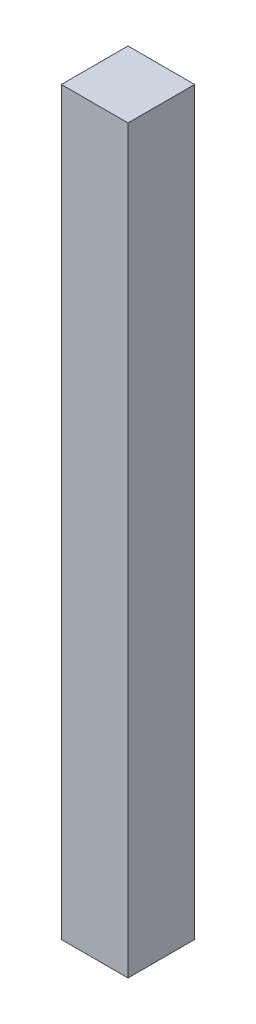
ISO-10303-21;
HEADER;
FILE_DESCRIPTION(('STEP AP214'),'2;1');
FILE_NAME('part.step','',(''),(''),'','','');
FILE_SCHEMA(('AUTOMOTIVE_DESIGN { 1 0 10303 214 1 1 1 1 }'));
ENDSEC;
DATA;
#1=APPLICATION_CONTEXT('core data for automotive mechanical design processes');
#2=APPLICATION_PROTOCOL_DEFINITION('international standard','automotive_design',2000,#1);
#3=PRODUCT_CONTEXT('',#1,'mechanical');
#4=PRODUCT('Part','Part','',(#3));
#5=PRODUCT_RELATED_PRODUCT_CATEGORY('part','',(#4));
#6=PRODUCT_DEFINITION_FORMATION('','',#4);
#7=PRODUCT_DEFINITION_CONTEXT('part definition',#1,'design');
#8=PRODUCT_DEFINITION('design','',#6,#7);
#9=PRODUCT_DEFINITION_SHAPE('','',#8);
#10=(LENGTH_UNIT() NAMED_UNIT(*) SI_UNIT(.MILLI.,.METRE.));
#11=(NAMED_UNIT(*) PLANE_ANGLE_UNIT() SI_UNIT($,.RADIAN.));
#12=(NAMED_UNIT(*) SI_UNIT($,.STERADIAN.) SOLID_ANGLE_UNIT());
#13=UNCERTAINTY_MEASURE_WITH_UNIT(LENGTH_MEASURE(1.E-05),#10,'distance_accuracy_value','');
#14=(GEOMETRIC_REPRESENTATION_CONTEXT(3) GLOBAL_UNCERTAINTY_ASSIGNED_CONTEXT((#13)) GLOBAL_UNIT_ASSIGNED_CONTEXT((#10,
#11,#12)) REPRESENTATION_CONTEXT('',''));
#15=CARTESIAN_POINT('',(0.,0.,0.));
#16=DIRECTION('',(0.,0.,1.));
#17=DIRECTION('',(1.,0.,0.));
#18=AXIS2_PLACEMENT_3D('',#15,#16,#17);
#19=CARTESIAN_POINT('',(637.,230.,26.));
#20=DIRECTION('',(1.,0.,0.));
#21=DIRECTION('',(0.,0.,-1.));
#22=AXIS2_PLACEMENT_3D('',#19,#20,#21);
#23=PLANE('',#22);
#24=DIRECTION('',(0.,-1.,0.));
#25=VECTOR('',#24,1.);
#26=CARTESIAN_POINT('',(637.,230.,8.));
#27=LINE('',#26,#25);
#28=CARTESIAN_POINT('',(637.,430.,8.));
#29=VERTEX_POINT('',#28);
#30=CARTESIAN_POINT('',(637.,230.,8.));
#31=VERTEX_POINT('',#30);
#32=EDGE_CURVE('E102',#29,#31,#27,.T.);
#33=ORIENTED_EDGE('',*,*,#32,.T.);
#34=DIRECTION('',(0.,0.,-1.));
#35=VECTOR('',#34,1.);
#36=CARTESIAN_POINT('',(637.,230.,26.));
#37=LINE('',#36,#35);
#38=CARTESIAN_POINT('',(637.,230.,26.));
#39=VERTEX_POINT('',#38);
#40=EDGE_CURVE('E11',#39,#31,#37,.T.);
#41=ORIENTED_EDGE('',*,*,#40,.F.);
#42=DIRECTION('',(0.,-1.,0.));
#43=VECTOR('',#42,1.);
#44=CARTESIAN_POINT('',(637.,230.,26.));
#45=LINE('',#44,#43);
#46=CARTESIAN_POINT('',(637.,430.,26.));
#47=VERTEX_POINT('',#46);
#48=EDGE_CURVE('E90',#47,#39,#45,.T.);
#49=ORIENTED_EDGE('',*,*,#48,.F.);
#50=DIRECTION('',(0.,0.,-1.));
#51=VECTOR('',#50,1.);
#52=CARTESIAN_POINT('',(637.,430.,26.));
#53=LINE('',#52,#51);
#54=EDGE_CURVE('E98',#47,#29,#53,.T.);
#55=ORIENTED_EDGE('',*,*,#54,.T.);
#56=EDGE_LOOP('',(#33,#41,#49,#55));
#57=FACE_BOUND('',#56,.T.);
#58=ADVANCED_FACE('F39',(#57),#23,.F.);
#59=CARTESIAN_POINT('',(637.,230.,26.));
#60=DIRECTION('',(0.,1.,0.));
#61=DIRECTION('',(0.,0.,1.));
#62=AXIS2_PLACEMENT_3D('',#59,#60,#61);
#63=PLANE('',#62);
#64=DIRECTION('',(1.,0.,0.));
#65=VECTOR('',#64,1.);
#66=CARTESIAN_POINT('',(637.,230.,8.));
#67=LINE('',#66,#65);
#68=CARTESIAN_POINT('',(655.,230.,8.));
#69=VERTEX_POINT('',#68);
#70=EDGE_CURVE('E94',#31,#69,#67,.T.);
#71=ORIENTED_EDGE('',*,*,#70,.T.);
#72=DIRECTION('',(0.,0.,-1.));
#73=VECTOR('',#72,1.);
#74=CARTESIAN_POINT('',(655.,230.,26.));
#75=LINE('',#74,#73);
#76=CARTESIAN_POINT('',(655.,230.,26.));
#77=VERTEX_POINT('',#76);
#78=EDGE_CURVE('E47',#77,#69,#75,.T.);
#79=ORIENTED_EDGE('',*,*,#78,.F.);
#80=DIRECTION('',(1.,0.,0.));
#81=VECTOR('',#80,1.);
#82=CARTESIAN_POINT('',(637.,230.,26.));
#83=LINE('',#82,#81);
#84=EDGE_CURVE('E85',#39,#77,#83,.T.);
#85=ORIENTED_EDGE('',*,*,#84,.F.);
#86=ORIENTED_EDGE('',*,*,#40,.T.);
#87=EDGE_LOOP('',(#71,#79,#85,#86));
#88=FACE_BOUND('',#87,.T.);
#89=ADVANCED_FACE('F93',(#88),#63,.F.);
#90=CARTESIAN_POINT('',(655.,230.,26.));
#91=DIRECTION('',(-1.,0.,0.));
#92=DIRECTION('',(0.,0.,1.));
#93=AXIS2_PLACEMENT_3D('',#90,#91,#92);
#94=PLANE('',#93);
#95=DIRECTION('',(0.,1.,0.));
#96=VECTOR('',#95,1.);
#97=CARTESIAN_POINT('',(655.,230.,8.));
#98=LINE('',#97,#96);
#99=CARTESIAN_POINT('',(655.,430.,8.));
#100=VERTEX_POINT('',#99);
#101=EDGE_CURVE('E72',#69,#100,#98,.T.);
#102=ORIENTED_EDGE('',*,*,#101,.T.);
#103=DIRECTION('',(0.,0.,-1.));
#104=VECTOR('',#103,1.);
#105=CARTESIAN_POINT('',(655.,430.,26.));
#106=LINE('',#105,#104);
#107=CARTESIAN_POINT('',(655.,430.,26.));
#108=VERTEX_POINT('',#107);
#109=EDGE_CURVE('E95',#108,#100,#106,.T.);
#110=ORIENTED_EDGE('',*,*,#109,.F.);
#111=DIRECTION('',(0.,1.,0.));
#112=VECTOR('',#111,1.);
#113=CARTESIAN_POINT('',(655.,230.,26.));
#114=LINE('',#113,#112);
#115=EDGE_CURVE('E88',#77,#108,#114,.T.);
#116=ORIENTED_EDGE('',*,*,#115,.F.);
#117=ORIENTED_EDGE('',*,*,#78,.T.);
#118=EDGE_LOOP('',(#102,#110,#116,#117));
#119=FACE_BOUND('',#118,.T.);
#120=ADVANCED_FACE('F96',(#119),#94,.F.);
#121=CARTESIAN_POINT('',(637.,430.,26.));
#122=DIRECTION('',(0.,-1.,0.));
#123=DIRECTION('',(0.,0.,-1.));
#124=AXIS2_PLACEMENT_3D('',#121,#122,#123);
#125=PLANE('',#124);
#126=DIRECTION('',(-1.,0.,0.));
#127=VECTOR('',#126,1.);
#128=CARTESIAN_POINT('',(637.,430.,8.));
#129=LINE('',#128,#127);
#130=EDGE_CURVE('E78',#100,#29,#129,.T.);
#131=ORIENTED_EDGE('',*,*,#130,.T.);
#132=ORIENTED_EDGE('',*,*,#54,.F.);
#133=DIRECTION('',(-1.,0.,0.));
#134=VECTOR('',#133,1.);
#135=CARTESIAN_POINT('',(637.,430.,26.));
#136=LINE('',#135,#134);
#137=EDGE_CURVE('E55',#108,#47,#136,.T.);
#138=ORIENTED_EDGE('',*,*,#137,.F.);
#139=ORIENTED_EDGE('',*,*,#109,.T.);
#140=EDGE_LOOP('',(#131,#132,#138,#139));
#141=FACE_BOUND('',#140,.T.);
#142=ADVANCED_FACE('F109',(#141),#125,.F.);
#143=CARTESIAN_POINT('',(0.,0.,26.));
#144=DIRECTION('',(0.,0.,-1.));
#145=DIRECTION('',(-1.,0.,0.));
#146=AXIS2_PLACEMENT_3D('',#143,#144,#145);
#147=PLANE('',#146);
#148=ORIENTED_EDGE('',*,*,#48,.T.);
#149=ORIENTED_EDGE('',*,*,#84,.T.);
#150=ORIENTED_EDGE('',*,*,#115,.T.);
#151=ORIENTED_EDGE('',*,*,#137,.T.);
#152=EDGE_LOOP('',(#148,#149,#150,#151));
#153=FACE_BOUND('',#152,.T.);
#154=ADVANCED_FACE('F86',(#153),#147,.F.);
#155=CARTESIAN_POINT('',(0.,0.,8.));
#156=DIRECTION('',(0.,0.,-1.));
#157=DIRECTION('',(-1.,0.,0.));
#158=AXIS2_PLACEMENT_3D('',#155,#156,#157);
#159=PLANE('',#158);
#160=ORIENTED_EDGE('',*,*,#32,.F.);
#161=ORIENTED_EDGE('',*,*,#130,.F.);
#162=ORIENTED_EDGE('',*,*,#101,.F.);
#163=ORIENTED_EDGE('',*,*,#70,.F.);
#164=EDGE_LOOP('',(#160,#161,#162,#163));
#165=FACE_BOUND('',#164,.T.);
#166=ADVANCED_FACE('F112',(#165),#159,.T.);
#167=CLOSED_SHELL('',(#58,#89,#120,#142,#154,#166));
#168=MANIFOLD_SOLID_BREP('B2',#167);
#169=ADVANCED_BREP_SHAPE_REPRESENTATION('',(#18,#168),#14);
#170=SHAPE_DEFINITION_REPRESENTATION(#9,#169);
ENDSEC;
END-ISO-10303-21;
